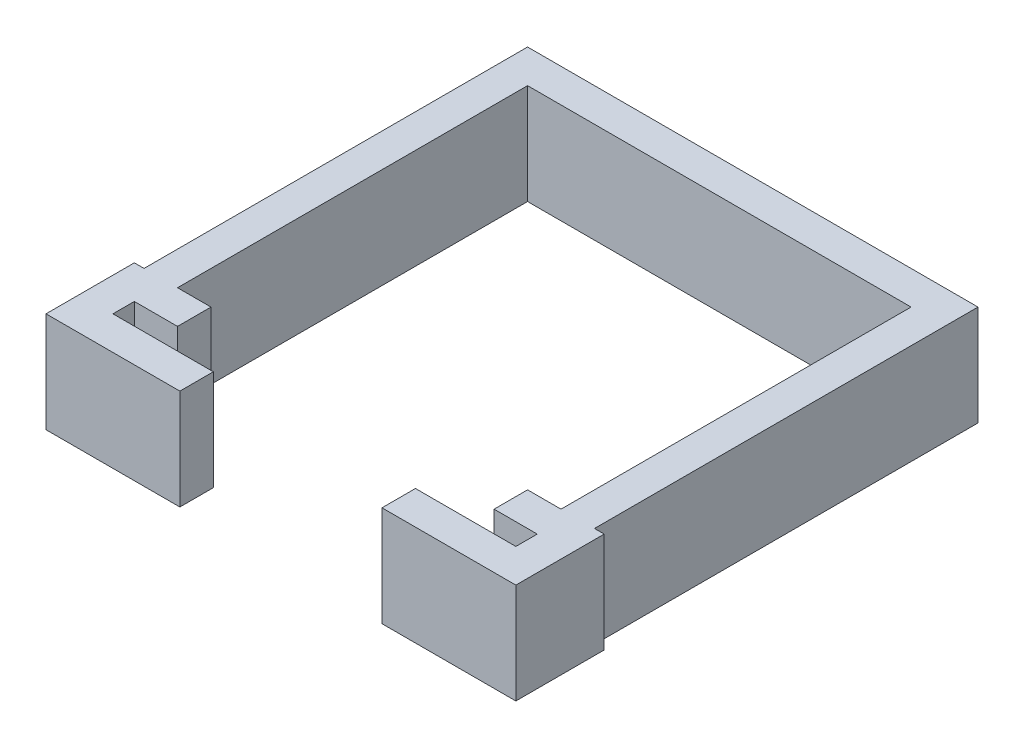
ISO-10303-21;
HEADER;
FILE_DESCRIPTION(('STEP AP214'),'2;1');
FILE_NAME('part.step','',(''),(''),'','','');
FILE_SCHEMA(('AUTOMOTIVE_DESIGN { 1 0 10303 214 1 1 1 1 }'));
ENDSEC;
DATA;
#1=APPLICATION_CONTEXT('core data for automotive mechanical design processes');
#2=APPLICATION_PROTOCOL_DEFINITION('international standard','automotive_design',2000,#1);
#3=PRODUCT_CONTEXT('',#1,'mechanical');
#4=PRODUCT('Part','Part','',(#3));
#5=PRODUCT_RELATED_PRODUCT_CATEGORY('part','',(#4));
#6=PRODUCT_DEFINITION_FORMATION('','',#4);
#7=PRODUCT_DEFINITION_CONTEXT('part definition',#1,'design');
#8=PRODUCT_DEFINITION('design','',#6,#7);
#9=PRODUCT_DEFINITION_SHAPE('','',#8);
#10=(LENGTH_UNIT() NAMED_UNIT(*) SI_UNIT(.MILLI.,.METRE.));
#11=(NAMED_UNIT(*) PLANE_ANGLE_UNIT() SI_UNIT($,.RADIAN.));
#12=(NAMED_UNIT(*) SI_UNIT($,.STERADIAN.) SOLID_ANGLE_UNIT());
#13=UNCERTAINTY_MEASURE_WITH_UNIT(LENGTH_MEASURE(1.E-05),#10,'distance_accuracy_value','');
#14=(GEOMETRIC_REPRESENTATION_CONTEXT(3) GLOBAL_UNCERTAINTY_ASSIGNED_CONTEXT((#13)) GLOBAL_UNIT_ASSIGNED_CONTEXT((#10,
#11,#12)) REPRESENTATION_CONTEXT('',''));
#15=CARTESIAN_POINT('',(0.,0.,0.));
#16=DIRECTION('',(0.,0.,1.));
#17=DIRECTION('',(1.,0.,0.));
#18=AXIS2_PLACEMENT_3D('',#15,#16,#17);
#19=CARTESIAN_POINT('',(43.75,15.,3.2));
#20=DIRECTION('',(0.,0.,1.));
#21=DIRECTION('',(1.,0.,0.));
#22=AXIS2_PLACEMENT_3D('',#19,#20,#21);
#23=PLANE('',#22);
#24=DIRECTION('',(-1.,0.,0.));
#25=VECTOR('',#24,1.);
#26=CARTESIAN_POINT('',(43.75,0.,3.2));
#27=LINE('',#26,#25);
#28=CARTESIAN_POINT('',(58.75,0.,3.2));
#29=VERTEX_POINT('',#28);
#30=CARTESIAN_POINT('',(48.65,0.,3.2));
#31=VERTEX_POINT('',#30);
#32=EDGE_CURVE('E200',#29,#31,#27,.T.);
#33=ORIENTED_EDGE('',*,*,#32,.T.);
#34=CARTESIAN_POINT('',(48.65,2.15,3.2));
#35=DIRECTION('',(0.,0.,-1.));
#36=DIRECTION('',(-1.,0.,0.));
#37=AXIS2_PLACEMENT_3D('',#34,#35,#36);
#38=CIRCLE('',#37,2.15);
#39=EDGE_CURVE('E203',#31,#31,#38,.T.);
#40=ORIENTED_EDGE('',*,*,#39,.F.);
#41=CARTESIAN_POINT('',(43.75,0.,3.2));
#42=VERTEX_POINT('',#41);
#43=EDGE_CURVE('E210',#31,#42,#27,.T.);
#44=ORIENTED_EDGE('',*,*,#43,.T.);
#45=DIRECTION('',(0.,-1.,0.));
#46=VECTOR('',#45,1.);
#47=CARTESIAN_POINT('',(43.75,15.,3.2));
#48=LINE('',#47,#46);
#49=CARTESIAN_POINT('',(43.75,15.,3.2));
#50=VERTEX_POINT('',#49);
#51=EDGE_CURVE('E259',#50,#42,#48,.T.);
#52=ORIENTED_EDGE('',*,*,#51,.F.);
#53=DIRECTION('',(-1.,0.,0.));
#54=VECTOR('',#53,1.);
#55=CARTESIAN_POINT('',(43.75,15.,3.2));
#56=LINE('',#55,#54);
#57=CARTESIAN_POINT('',(58.75,15.,3.2));
#58=VERTEX_POINT('',#57);
#59=EDGE_CURVE('E325',#58,#50,#56,.T.);
#60=ORIENTED_EDGE('',*,*,#59,.F.);
#61=DIRECTION('',(0.,-1.,0.));
#62=VECTOR('',#61,1.);
#63=CARTESIAN_POINT('',(58.75,15.,3.2));
#64=LINE('',#63,#62);
#65=EDGE_CURVE('E206',#58,#29,#64,.T.);
#66=ORIENTED_EDGE('',*,*,#65,.T.);
#67=EDGE_LOOP('',(#33,#40,#44,#52,#60,#66));
#68=FACE_BOUND('',#67,.T.);
#69=ADVANCED_FACE('F31',(#68),#23,.F.);
#70=CARTESIAN_POINT('',(-1.45,15.,3.2));
#71=DIRECTION('',(0.,0.,1.));
#72=DIRECTION('',(1.,0.,0.));
#73=AXIS2_PLACEMENT_3D('',#70,#71,#72);
#74=PLANE('',#73);
#75=DIRECTION('',(-1.,0.,0.));
#76=VECTOR('',#75,1.);
#77=CARTESIAN_POINT('',(-1.45,0.,3.2));
#78=LINE('',#77,#76);
#79=CARTESIAN_POINT('',(13.55,0.,3.2));
#80=VERTEX_POINT('',#79);
#81=CARTESIAN_POINT('',(8.65,0.,3.2));
#82=VERTEX_POINT('',#81);
#83=EDGE_CURVE('E302',#80,#82,#78,.T.);
#84=ORIENTED_EDGE('',*,*,#83,.T.);
#85=CARTESIAN_POINT('',(8.65,2.15,3.2));
#86=DIRECTION('',(0.,0.,-1.));
#87=DIRECTION('',(-1.,0.,0.));
#88=AXIS2_PLACEMENT_3D('',#85,#86,#87);
#89=CIRCLE('',#88,2.15);
#90=EDGE_CURVE('E396',#82,#82,#89,.T.);
#91=ORIENTED_EDGE('',*,*,#90,.F.);
#92=CARTESIAN_POINT('',(-1.45,0.,3.2));
#93=VERTEX_POINT('',#92);
#94=EDGE_CURVE('E296',#82,#93,#78,.T.);
#95=ORIENTED_EDGE('',*,*,#94,.T.);
#96=DIRECTION('',(0.,-1.,0.));
#97=VECTOR('',#96,1.);
#98=CARTESIAN_POINT('',(-1.45,15.,3.2));
#99=LINE('',#98,#97);
#100=CARTESIAN_POINT('',(-1.45,15.,3.2));
#101=VERTEX_POINT('',#100);
#102=EDGE_CURVE('E273',#101,#93,#99,.T.);
#103=ORIENTED_EDGE('',*,*,#102,.F.);
#104=DIRECTION('',(-1.,0.,0.));
#105=VECTOR('',#104,1.);
#106=CARTESIAN_POINT('',(-1.45,15.,3.2));
#107=LINE('',#106,#105);
#108=CARTESIAN_POINT('',(13.55,15.,3.2));
#109=VERTEX_POINT('',#108);
#110=EDGE_CURVE('E368',#109,#101,#107,.T.);
#111=ORIENTED_EDGE('',*,*,#110,.F.);
#112=DIRECTION('',(0.,-1.,0.));
#113=VECTOR('',#112,1.);
#114=CARTESIAN_POINT('',(13.55,15.,3.2));
#115=LINE('',#114,#113);
#116=EDGE_CURVE('E276',#109,#80,#115,.T.);
#117=ORIENTED_EDGE('',*,*,#116,.T.);
#118=EDGE_LOOP('',(#84,#91,#95,#103,#111,#117));
#119=FACE_BOUND('',#118,.T.);
#120=ADVANCED_FACE('F429',(#119),#74,.F.);
#121=CARTESIAN_POINT('',(57.3,15.,0.));
#122=DIRECTION('',(1.,0.,0.));
#123=DIRECTION('',(0.,0.,-1.));
#124=AXIS2_PLACEMENT_3D('',#121,#122,#123);
#125=PLANE('',#124);
#126=DIRECTION('',(0.,-1.,0.));
#127=VECTOR('',#126,1.);
#128=CARTESIAN_POINT('',(57.3,15.,-5.));
#129=LINE('',#128,#127);
#130=CARTESIAN_POINT('',(57.3,15.,-5.));
#131=VERTEX_POINT('',#130);
#132=CARTESIAN_POINT('',(57.3,0.,-5.));
#133=VERTEX_POINT('',#132);
#134=EDGE_CURVE('E46',#131,#133,#129,.T.);
#135=ORIENTED_EDGE('',*,*,#134,.F.);
#136=DIRECTION('',(0.,0.,1.));
#137=VECTOR('',#136,1.);
#138=CARTESIAN_POINT('',(57.3,15.,0.));
#139=LINE('',#138,#137);
#140=CARTESIAN_POINT('',(57.3,15.,-57.3));
#141=VERTEX_POINT('',#140);
#142=EDGE_CURVE('E330',#141,#131,#139,.T.);
#143=ORIENTED_EDGE('',*,*,#142,.F.);
#144=DIRECTION('',(0.,-1.,0.));
#145=VECTOR('',#144,1.);
#146=CARTESIAN_POINT('',(57.3,15.,-57.3));
#147=LINE('',#146,#145);
#148=CARTESIAN_POINT('',(57.3,0.,-57.3));
#149=VERTEX_POINT('',#148);
#150=EDGE_CURVE('E265',#141,#149,#147,.T.);
#151=ORIENTED_EDGE('',*,*,#150,.T.);
#152=DIRECTION('',(0.,0.,1.));
#153=VECTOR('',#152,1.);
#154=CARTESIAN_POINT('',(57.3,0.,0.));
#155=LINE('',#154,#153);
#156=EDGE_CURVE('E51',#149,#133,#155,.T.);
#157=ORIENTED_EDGE('',*,*,#156,.T.);
#158=EDGE_LOOP('',(#135,#143,#151,#157));
#159=FACE_BOUND('',#158,.T.);
#160=ADVANCED_FACE('F427',(#159),#125,.F.);
#161=CARTESIAN_POINT('',(0.,15.,-57.3));
#162=DIRECTION('',(-1.,0.,0.));
#163=DIRECTION('',(0.,0.,1.));
#164=AXIS2_PLACEMENT_3D('',#161,#162,#163);
#165=PLANE('',#164);
#166=DIRECTION('',(0.,-1.,0.));
#167=VECTOR('',#166,1.);
#168=CARTESIAN_POINT('',(0.,15.,-5.));
#169=LINE('',#168,#167);
#170=CARTESIAN_POINT('',(0.,15.,-5.));
#171=VERTEX_POINT('',#170);
#172=CARTESIAN_POINT('',(0.,0.,-5.));
#173=VERTEX_POINT('',#172);
#174=EDGE_CURVE('E357',#171,#173,#169,.T.);
#175=ORIENTED_EDGE('',*,*,#174,.T.);
#176=DIRECTION('',(0.,0.,-1.));
#177=VECTOR('',#176,1.);
#178=CARTESIAN_POINT('',(0.,0.,-57.3));
#179=LINE('',#178,#177);
#180=CARTESIAN_POINT('',(0.,0.,-57.3));
#181=VERTEX_POINT('',#180);
#182=EDGE_CURVE('E308',#173,#181,#179,.T.);
#183=ORIENTED_EDGE('',*,*,#182,.T.);
#184=DIRECTION('',(0.,-1.,0.));
#185=VECTOR('',#184,1.);
#186=CARTESIAN_POINT('',(0.,15.,-57.3));
#187=LINE('',#186,#185);
#188=CARTESIAN_POINT('',(0.,15.,-57.3));
#189=VERTEX_POINT('',#188);
#190=EDGE_CURVE('E267',#189,#181,#187,.T.);
#191=ORIENTED_EDGE('',*,*,#190,.F.);
#192=DIRECTION('',(0.,0.,-1.));
#193=VECTOR('',#192,1.);
#194=CARTESIAN_POINT('',(0.,15.,-57.3));
#195=LINE('',#194,#193);
#196=EDGE_CURVE('E374',#171,#189,#195,.T.);
#197=ORIENTED_EDGE('',*,*,#196,.F.);
#198=EDGE_LOOP('',(#175,#183,#191,#197));
#199=FACE_BOUND('',#198,.T.);
#200=ADVANCED_FACE('F416',(#199),#165,.F.);
#201=CARTESIAN_POINT('',(-6.45,15.,-5.));
#202=DIRECTION('',(0.,0.,1.));
#203=DIRECTION('',(1.,0.,0.));
#204=AXIS2_PLACEMENT_3D('',#201,#202,#203);
#205=PLANE('',#204);
#206=DIRECTION('',(-1.,0.,0.));
#207=VECTOR('',#206,1.);
#208=CARTESIAN_POINT('',(-6.45,0.,-5.));
#209=LINE('',#208,#207);
#210=CARTESIAN_POINT('',(-5.,0.,-5.));
#211=VERTEX_POINT('',#210);
#212=CARTESIAN_POINT('',(-6.45,0.,-5.));
#213=VERTEX_POINT('',#212);
#214=EDGE_CURVE('E298',#211,#213,#209,.T.);
#215=ORIENTED_EDGE('',*,*,#214,.T.);
#216=DIRECTION('',(0.,-1.,0.));
#217=VECTOR('',#216,1.);
#218=CARTESIAN_POINT('',(-6.45,15.,-5.));
#219=LINE('',#218,#217);
#220=CARTESIAN_POINT('',(-6.45,15.,-5.));
#221=VERTEX_POINT('',#220);
#222=EDGE_CURVE('E11',#221,#213,#219,.T.);
#223=ORIENTED_EDGE('',*,*,#222,.F.);
#224=DIRECTION('',(-1.,0.,0.));
#225=VECTOR('',#224,1.);
#226=CARTESIAN_POINT('',(-6.45,15.,-5.));
#227=LINE('',#226,#225);
#228=CARTESIAN_POINT('',(-5.,15.,-5.));
#229=VERTEX_POINT('',#228);
#230=EDGE_CURVE('E236',#229,#221,#227,.T.);
#231=ORIENTED_EDGE('',*,*,#230,.F.);
#232=DIRECTION('',(0.,-1.,0.));
#233=VECTOR('',#232,1.);
#234=CARTESIAN_POINT('',(-5.,15.,-5.));
#235=LINE('',#234,#233);
#236=EDGE_CURVE('E237',#229,#211,#235,.T.);
#237=ORIENTED_EDGE('',*,*,#236,.T.);
#238=EDGE_LOOP('',(#215,#223,#231,#237));
#239=FACE_BOUND('',#238,.T.);
#240=ADVANCED_FACE('F33',(#239),#205,.F.);
#241=CARTESIAN_POINT('',(-6.45,15.,8.20000000000001));
#242=DIRECTION('',(1.,0.,0.));
#243=DIRECTION('',(0.,0.,-1.));
#244=AXIS2_PLACEMENT_3D('',#241,#242,#243);
#245=PLANE('',#244);
#246=DIRECTION('',(0.,0.,1.));
#247=VECTOR('',#246,1.);
#248=CARTESIAN_POINT('',(-6.45,0.,8.20000000000001));
#249=LINE('',#248,#247);
#250=CARTESIAN_POINT('',(-6.45,0.,8.20000000000001));
#251=VERTEX_POINT('',#250);
#252=EDGE_CURVE('E292',#213,#251,#249,.T.);
#253=ORIENTED_EDGE('',*,*,#252,.T.);
#254=DIRECTION('',(0.,-1.,0.));
#255=VECTOR('',#254,1.);
#256=CARTESIAN_POINT('',(-6.45,15.,8.20000000000001));
#257=LINE('',#256,#255);
#258=CARTESIAN_POINT('',(-6.45,15.,8.20000000000001));
#259=VERTEX_POINT('',#258);
#260=EDGE_CURVE('E39',#259,#251,#257,.T.);
#261=ORIENTED_EDGE('',*,*,#260,.F.);
#262=DIRECTION('',(0.,0.,1.));
#263=VECTOR('',#262,1.);
#264=CARTESIAN_POINT('',(-6.45,15.,8.20000000000001));
#265=LINE('',#264,#263);
#266=EDGE_CURVE('E363',#221,#259,#265,.T.);
#267=ORIENTED_EDGE('',*,*,#266,.F.);
#268=ORIENTED_EDGE('',*,*,#222,.T.);
#269=EDGE_LOOP('',(#253,#261,#267,#268));
#270=FACE_BOUND('',#269,.T.);
#271=ADVANCED_FACE('F469',(#270),#245,.F.);
#272=CARTESIAN_POINT('',(13.55,15.,8.2));
#273=DIRECTION('',(0.,0.,-1.));
#274=DIRECTION('',(-1.,0.,0.));
#275=AXIS2_PLACEMENT_3D('',#272,#273,#274);
#276=PLANE('',#275);
#277=DIRECTION('',(1.,0.,0.));
#278=VECTOR('',#277,1.);
#279=CARTESIAN_POINT('',(13.55,0.,8.2));
#280=LINE('',#279,#278);
#281=CARTESIAN_POINT('',(13.55,0.,8.2));
#282=VERTEX_POINT('',#281);
#283=EDGE_CURVE('E288',#251,#282,#280,.T.);
#284=ORIENTED_EDGE('',*,*,#283,.T.);
#285=DIRECTION('',(0.,-1.,0.));
#286=VECTOR('',#285,1.);
#287=CARTESIAN_POINT('',(13.55,15.,8.2));
#288=LINE('',#287,#286);
#289=CARTESIAN_POINT('',(13.55,15.,8.2));
#290=VERTEX_POINT('',#289);
#291=EDGE_CURVE('E279',#290,#282,#288,.T.);
#292=ORIENTED_EDGE('',*,*,#291,.F.);
#293=DIRECTION('',(1.,0.,0.));
#294=VECTOR('',#293,1.);
#295=CARTESIAN_POINT('',(13.55,15.,8.2));
#296=LINE('',#295,#294);
#297=EDGE_CURVE('E289',#259,#290,#296,.T.);
#298=ORIENTED_EDGE('',*,*,#297,.F.);
#299=ORIENTED_EDGE('',*,*,#260,.T.);
#300=EDGE_LOOP('',(#284,#292,#298,#299));
#301=FACE_BOUND('',#300,.T.);
#302=ADVANCED_FACE('F286',(#301),#276,.F.);
#303=CARTESIAN_POINT('',(13.55,15.,3.2));
#304=DIRECTION('',(-1.,0.,0.));
#305=DIRECTION('',(0.,0.,1.));
#306=AXIS2_PLACEMENT_3D('',#303,#304,#305);
#307=PLANE('',#306);
#308=DIRECTION('',(0.,0.,-1.));
#309=VECTOR('',#308,1.);
#310=CARTESIAN_POINT('',(13.55,0.,3.2));
#311=LINE('',#310,#309);
#312=EDGE_CURVE('E294',#282,#80,#311,.T.);
#313=ORIENTED_EDGE('',*,*,#312,.T.);
#314=ORIENTED_EDGE('',*,*,#116,.F.);
#315=DIRECTION('',(0.,0.,-1.));
#316=VECTOR('',#315,1.);
#317=CARTESIAN_POINT('',(13.55,15.,3.2));
#318=LINE('',#317,#316);
#319=EDGE_CURVE('E366',#290,#109,#318,.T.);
#320=ORIENTED_EDGE('',*,*,#319,.F.);
#321=ORIENTED_EDGE('',*,*,#291,.T.);
#322=EDGE_LOOP('',(#313,#314,#320,#321));
#323=FACE_BOUND('',#322,.T.);
#324=ADVANCED_FACE('F462',(#323),#307,.F.);
#325=CARTESIAN_POINT('',(-1.45,15.,0.));
#326=DIRECTION('',(-1.,0.,0.));
#327=DIRECTION('',(0.,0.,1.));
#328=AXIS2_PLACEMENT_3D('',#325,#326,#327);
#329=PLANE('',#328);
#330=DIRECTION('',(0.,0.,-1.));
#331=VECTOR('',#330,1.);
#332=CARTESIAN_POINT('',(-1.45,0.,0.));
#333=LINE('',#332,#331);
#334=CARTESIAN_POINT('',(-1.45,0.,0.));
#335=VERTEX_POINT('',#334);
#336=EDGE_CURVE('E304',#93,#335,#333,.T.);
#337=ORIENTED_EDGE('',*,*,#336,.T.);
#338=DIRECTION('',(0.,-1.,0.));
#339=VECTOR('',#338,1.);
#340=CARTESIAN_POINT('',(-1.45,15.,0.));
#341=LINE('',#340,#339);
#342=CARTESIAN_POINT('',(-1.45,15.,0.));
#343=VERTEX_POINT('',#342);
#344=EDGE_CURVE('E270',#343,#335,#341,.T.);
#345=ORIENTED_EDGE('',*,*,#344,.F.);
#346=DIRECTION('',(0.,0.,-1.));
#347=VECTOR('',#346,1.);
#348=CARTESIAN_POINT('',(-1.45,15.,0.));
#349=LINE('',#348,#347);
#350=EDGE_CURVE('E370',#101,#343,#349,.T.);
#351=ORIENTED_EDGE('',*,*,#350,.F.);
#352=ORIENTED_EDGE('',*,*,#102,.T.);
#353=EDGE_LOOP('',(#337,#345,#351,#352));
#354=FACE_BOUND('',#353,.T.);
#355=ADVANCED_FACE('F457',(#354),#329,.F.);
#356=CARTESIAN_POINT('',(0.,15.,0.));
#357=DIRECTION('',(0.,0.,-1.));
#358=DIRECTION('',(-1.,0.,0.));
#359=AXIS2_PLACEMENT_3D('',#356,#357,#358);
#360=PLANE('',#359);
#361=DIRECTION('',(1.,0.,0.));
#362=VECTOR('',#361,1.);
#363=CARTESIAN_POINT('',(0.,0.,0.));
#364=LINE('',#363,#362);
#365=CARTESIAN_POINT('',(5.,0.,0.));
#366=VERTEX_POINT('',#365);
#367=EDGE_CURVE('E306',#335,#366,#364,.T.);
#368=ORIENTED_EDGE('',*,*,#367,.T.);
#369=DIRECTION('',(0.,-1.,0.));
#370=VECTOR('',#369,1.);
#371=CARTESIAN_POINT('',(5.,15.,0.));
#372=LINE('',#371,#370);
#373=CARTESIAN_POINT('',(5.,15.,0.));
#374=VERTEX_POINT('',#373);
#375=EDGE_CURVE('E346',#374,#366,#372,.T.);
#376=ORIENTED_EDGE('',*,*,#375,.F.);
#377=DIRECTION('',(1.,0.,0.));
#378=VECTOR('',#377,1.);
#379=CARTESIAN_POINT('',(0.,15.,0.));
#380=LINE('',#379,#378);
#381=EDGE_CURVE('E372',#343,#374,#380,.T.);
#382=ORIENTED_EDGE('',*,*,#381,.F.);
#383=ORIENTED_EDGE('',*,*,#344,.T.);
#384=EDGE_LOOP('',(#368,#376,#382,#383));
#385=FACE_BOUND('',#384,.T.);
#386=ADVANCED_FACE('F453',(#385),#360,.F.);
#387=CARTESIAN_POINT('',(57.3,15.,-57.3));
#388=DIRECTION('',(0.,0.,-1.));
#389=DIRECTION('',(-1.,0.,0.));
#390=AXIS2_PLACEMENT_3D('',#387,#388,#389);
#391=PLANE('',#390);
#392=DIRECTION('',(1.,0.,0.));
#393=VECTOR('',#392,1.);
#394=CARTESIAN_POINT('',(57.3,0.,-57.3));
#395=LINE('',#394,#393);
#396=EDGE_CURVE('E310',#181,#149,#395,.T.);
#397=ORIENTED_EDGE('',*,*,#396,.T.);
#398=ORIENTED_EDGE('',*,*,#150,.F.);
#399=DIRECTION('',(1.,0.,0.));
#400=VECTOR('',#399,1.);
#401=CARTESIAN_POINT('',(57.3,15.,-57.3));
#402=LINE('',#401,#400);
#403=EDGE_CURVE('E376',#189,#141,#402,.T.);
#404=ORIENTED_EDGE('',*,*,#403,.F.);
#405=ORIENTED_EDGE('',*,*,#190,.T.);
#406=EDGE_LOOP('',(#397,#398,#404,#405));
#407=FACE_BOUND('',#406,.T.);
#408=ADVANCED_FACE('F426',(#407),#391,.F.);
#409=CARTESIAN_POINT('',(58.75,15.,0.));
#410=DIRECTION('',(0.,0.,-1.));
#411=DIRECTION('',(-1.,0.,0.));
#412=AXIS2_PLACEMENT_3D('',#409,#410,#411);
#413=PLANE('',#412);
#414=DIRECTION('',(1.,0.,0.));
#415=VECTOR('',#414,1.);
#416=CARTESIAN_POINT('',(58.75,0.,0.));
#417=LINE('',#416,#415);
#418=CARTESIAN_POINT('',(52.3,0.,0.));
#419=VERTEX_POINT('',#418);
#420=CARTESIAN_POINT('',(58.75,0.,0.));
#421=VERTEX_POINT('',#420);
#422=EDGE_CURVE('E219',#419,#421,#417,.T.);
#423=ORIENTED_EDGE('',*,*,#422,.T.);
#424=DIRECTION('',(0.,-1.,0.));
#425=VECTOR('',#424,1.);
#426=CARTESIAN_POINT('',(58.75,15.,0.));
#427=LINE('',#426,#425);
#428=CARTESIAN_POINT('',(58.75,15.,0.));
#429=VERTEX_POINT('',#428);
#430=EDGE_CURVE('E262',#429,#421,#427,.T.);
#431=ORIENTED_EDGE('',*,*,#430,.F.);
#432=DIRECTION('',(1.,0.,0.));
#433=VECTOR('',#432,1.);
#434=CARTESIAN_POINT('',(58.75,15.,0.));
#435=LINE('',#434,#433);
#436=CARTESIAN_POINT('',(52.3,15.,0.));
#437=VERTEX_POINT('',#436);
#438=EDGE_CURVE('E326',#437,#429,#435,.T.);
#439=ORIENTED_EDGE('',*,*,#438,.F.);
#440=DIRECTION('',(0.,-1.,0.));
#441=VECTOR('',#440,1.);
#442=CARTESIAN_POINT('',(52.3,15.,0.));
#443=LINE('',#442,#441);
#444=EDGE_CURVE('E318',#437,#419,#443,.T.);
#445=ORIENTED_EDGE('',*,*,#444,.T.);
#446=EDGE_LOOP('',(#423,#431,#439,#445));
#447=FACE_BOUND('',#446,.T.);
#448=ADVANCED_FACE('F315',(#447),#413,.F.);
#449=CARTESIAN_POINT('',(58.75,15.,3.2));
#450=DIRECTION('',(1.,0.,0.));
#451=DIRECTION('',(0.,0.,-1.));
#452=AXIS2_PLACEMENT_3D('',#449,#450,#451);
#453=PLANE('',#452);
#454=DIRECTION('',(0.,0.,1.));
#455=VECTOR('',#454,1.);
#456=CARTESIAN_POINT('',(58.75,0.,3.2));
#457=LINE('',#456,#455);
#458=EDGE_CURVE('E218',#421,#29,#457,.T.);
#459=ORIENTED_EDGE('',*,*,#458,.T.);
#460=ORIENTED_EDGE('',*,*,#65,.F.);
#461=DIRECTION('',(0.,0.,1.));
#462=VECTOR('',#461,1.);
#463=CARTESIAN_POINT('',(58.75,15.,3.2));
#464=LINE('',#463,#462);
#465=EDGE_CURVE('E323',#429,#58,#464,.T.);
#466=ORIENTED_EDGE('',*,*,#465,.F.);
#467=ORIENTED_EDGE('',*,*,#430,.T.);
#468=EDGE_LOOP('',(#459,#460,#466,#467));
#469=FACE_BOUND('',#468,.T.);
#470=ADVANCED_FACE('F322',(#469),#453,.F.);
#471=CARTESIAN_POINT('',(43.75,15.,8.2));
#472=DIRECTION('',(1.,0.,0.));
#473=DIRECTION('',(0.,0.,-1.));
#474=AXIS2_PLACEMENT_3D('',#471,#472,#473);
#475=PLANE('',#474);
#476=DIRECTION('',(0.,0.,1.));
#477=VECTOR('',#476,1.);
#478=CARTESIAN_POINT('',(43.75,0.,8.2));
#479=LINE('',#478,#477);
#480=CARTESIAN_POINT('',(43.75,0.,8.2));
#481=VERTEX_POINT('',#480);
#482=EDGE_CURVE('E209',#42,#481,#479,.T.);
#483=ORIENTED_EDGE('',*,*,#482,.T.);
#484=DIRECTION('',(0.,-1.,0.));
#485=VECTOR('',#484,1.);
#486=CARTESIAN_POINT('',(43.75,15.,8.2));
#487=LINE('',#486,#485);
#488=CARTESIAN_POINT('',(43.75,15.,8.2));
#489=VERTEX_POINT('',#488);
#490=EDGE_CURVE('E256',#489,#481,#487,.T.);
#491=ORIENTED_EDGE('',*,*,#490,.F.);
#492=DIRECTION('',(0.,0.,1.));
#493=VECTOR('',#492,1.);
#494=CARTESIAN_POINT('',(43.75,15.,8.2));
#495=LINE('',#494,#493);
#496=EDGE_CURVE('E328',#50,#489,#495,.T.);
#497=ORIENTED_EDGE('',*,*,#496,.F.);
#498=ORIENTED_EDGE('',*,*,#51,.T.);
#499=EDGE_LOOP('',(#483,#491,#497,#498));
#500=FACE_BOUND('',#499,.T.);
#501=ADVANCED_FACE('F446',(#500),#475,.F.);
#502=CARTESIAN_POINT('',(63.75,15.,8.2));
#503=DIRECTION('',(0.,0.,-1.));
#504=DIRECTION('',(-1.,0.,0.));
#505=AXIS2_PLACEMENT_3D('',#502,#503,#504);
#506=PLANE('',#505);
#507=DIRECTION('',(1.,0.,0.));
#508=VECTOR('',#507,1.);
#509=CARTESIAN_POINT('',(63.75,0.,8.2));
#510=LINE('',#509,#508);
#511=CARTESIAN_POINT('',(63.75,0.,8.2));
#512=VERTEX_POINT('',#511);
#513=EDGE_CURVE('E224',#481,#512,#510,.T.);
#514=ORIENTED_EDGE('',*,*,#513,.T.);
#515=DIRECTION('',(0.,-1.,0.));
#516=VECTOR('',#515,1.);
#517=CARTESIAN_POINT('',(63.75,15.,8.2));
#518=LINE('',#517,#516);
#519=CARTESIAN_POINT('',(63.75,15.,8.2));
#520=VERTEX_POINT('',#519);
#521=EDGE_CURVE('E253',#520,#512,#518,.T.);
#522=ORIENTED_EDGE('',*,*,#521,.F.);
#523=DIRECTION('',(1.,0.,0.));
#524=VECTOR('',#523,1.);
#525=CARTESIAN_POINT('',(63.75,15.,8.2));
#526=LINE('',#525,#524);
#527=EDGE_CURVE('E335',#489,#520,#526,.T.);
#528=ORIENTED_EDGE('',*,*,#527,.F.);
#529=ORIENTED_EDGE('',*,*,#490,.T.);
#530=EDGE_LOOP('',(#514,#522,#528,#529));
#531=FACE_BOUND('',#530,.T.);
#532=ADVANCED_FACE('F503',(#531),#506,.F.);
#533=CARTESIAN_POINT('',(63.75,15.,-5.));
#534=DIRECTION('',(-1.,0.,0.));
#535=DIRECTION('',(0.,0.,1.));
#536=AXIS2_PLACEMENT_3D('',#533,#534,#535);
#537=PLANE('',#536);
#538=DIRECTION('',(0.,0.,-1.));
#539=VECTOR('',#538,1.);
#540=CARTESIAN_POINT('',(63.75,0.,-5.));
#541=LINE('',#540,#539);
#542=CARTESIAN_POINT('',(63.75,0.,-5.));
#543=VERTEX_POINT('',#542);
#544=EDGE_CURVE('E226',#512,#543,#541,.T.);
#545=ORIENTED_EDGE('',*,*,#544,.T.);
#546=DIRECTION('',(0.,-1.,0.));
#547=VECTOR('',#546,1.);
#548=CARTESIAN_POINT('',(63.75,15.,-5.));
#549=LINE('',#548,#547);
#550=CARTESIAN_POINT('',(63.75,15.,-5.));
#551=VERTEX_POINT('',#550);
#552=EDGE_CURVE('E250',#551,#543,#549,.T.);
#553=ORIENTED_EDGE('',*,*,#552,.F.);
#554=DIRECTION('',(0.,0.,-1.));
#555=VECTOR('',#554,1.);
#556=CARTESIAN_POINT('',(63.75,15.,-5.));
#557=LINE('',#556,#555);
#558=EDGE_CURVE('E337',#520,#551,#557,.T.);
#559=ORIENTED_EDGE('',*,*,#558,.F.);
#560=ORIENTED_EDGE('',*,*,#521,.T.);
#561=EDGE_LOOP('',(#545,#553,#559,#560));
#562=FACE_BOUND('',#561,.T.);
#563=ADVANCED_FACE('F498',(#562),#537,.F.);
#564=CARTESIAN_POINT('',(62.3,15.,-5.));
#565=DIRECTION('',(0.,0.,1.));
#566=DIRECTION('',(1.,0.,0.));
#567=AXIS2_PLACEMENT_3D('',#564,#565,#566);
#568=PLANE('',#567);
#569=DIRECTION('',(-1.,0.,0.));
#570=VECTOR('',#569,1.);
#571=CARTESIAN_POINT('',(62.3,0.,-5.));
#572=LINE('',#571,#570);
#573=CARTESIAN_POINT('',(62.3,0.,-5.));
#574=VERTEX_POINT('',#573);
#575=EDGE_CURVE('E228',#543,#574,#572,.T.);
#576=ORIENTED_EDGE('',*,*,#575,.T.);
#577=DIRECTION('',(0.,-1.,0.));
#578=VECTOR('',#577,1.);
#579=CARTESIAN_POINT('',(62.3,15.,-5.));
#580=LINE('',#579,#578);
#581=CARTESIAN_POINT('',(62.3,15.,-5.));
#582=VERTEX_POINT('',#581);
#583=EDGE_CURVE('E247',#582,#574,#580,.T.);
#584=ORIENTED_EDGE('',*,*,#583,.F.);
#585=DIRECTION('',(-1.,0.,0.));
#586=VECTOR('',#585,1.);
#587=CARTESIAN_POINT('',(62.3,15.,-5.));
#588=LINE('',#587,#586);
#589=EDGE_CURVE('E339',#551,#582,#588,.T.);
#590=ORIENTED_EDGE('',*,*,#589,.F.);
#591=ORIENTED_EDGE('',*,*,#552,.T.);
#592=EDGE_LOOP('',(#576,#584,#590,#591));
#593=FACE_BOUND('',#592,.T.);
#594=ADVANCED_FACE('F494',(#593),#568,.F.);
#595=CARTESIAN_POINT('',(62.3,15.,-62.3));
#596=DIRECTION('',(-1.,0.,0.));
#597=DIRECTION('',(0.,0.,1.));
#598=AXIS2_PLACEMENT_3D('',#595,#596,#597);
#599=PLANE('',#598);
#600=DIRECTION('',(0.,0.,-1.));
#601=VECTOR('',#600,1.);
#602=CARTESIAN_POINT('',(62.3,0.,-62.3));
#603=LINE('',#602,#601);
#604=CARTESIAN_POINT('',(62.3,0.,-62.3));
#605=VERTEX_POINT('',#604);
#606=EDGE_CURVE('E230',#574,#605,#603,.T.);
#607=ORIENTED_EDGE('',*,*,#606,.T.);
#608=DIRECTION('',(0.,-1.,0.));
#609=VECTOR('',#608,1.);
#610=CARTESIAN_POINT('',(62.3,15.,-62.3));
#611=LINE('',#610,#609);
#612=CARTESIAN_POINT('',(62.3,15.,-62.3));
#613=VERTEX_POINT('',#612);
#614=EDGE_CURVE('E244',#613,#605,#611,.T.);
#615=ORIENTED_EDGE('',*,*,#614,.F.);
#616=DIRECTION('',(0.,0.,-1.));
#617=VECTOR('',#616,1.);
#618=CARTESIAN_POINT('',(62.3,15.,-62.3));
#619=LINE('',#618,#617);
#620=EDGE_CURVE('E341',#582,#613,#619,.T.);
#621=ORIENTED_EDGE('',*,*,#620,.F.);
#622=ORIENTED_EDGE('',*,*,#583,.T.);
#623=EDGE_LOOP('',(#607,#615,#621,#622));
#624=FACE_BOUND('',#623,.T.);
#625=ADVANCED_FACE('F490',(#624),#599,.F.);
#626=CARTESIAN_POINT('',(-5.,15.,-62.3));
#627=DIRECTION('',(0.,0.,1.));
#628=DIRECTION('',(1.,0.,0.));
#629=AXIS2_PLACEMENT_3D('',#626,#627,#628);
#630=PLANE('',#629);
#631=DIRECTION('',(-1.,0.,0.));
#632=VECTOR('',#631,1.);
#633=CARTESIAN_POINT('',(-5.,0.,-62.3));
#634=LINE('',#633,#632);
#635=CARTESIAN_POINT('',(-5.,0.,-62.3));
#636=VERTEX_POINT('',#635);
#637=EDGE_CURVE('E232',#605,#636,#634,.T.);
#638=ORIENTED_EDGE('',*,*,#637,.T.);
#639=DIRECTION('',(0.,-1.,0.));
#640=VECTOR('',#639,1.);
#641=CARTESIAN_POINT('',(-5.,15.,-62.3));
#642=LINE('',#641,#640);
#643=CARTESIAN_POINT('',(-5.,15.,-62.3));
#644=VERTEX_POINT('',#643);
#645=EDGE_CURVE('E240',#644,#636,#642,.T.);
#646=ORIENTED_EDGE('',*,*,#645,.F.);
#647=DIRECTION('',(-1.,0.,0.));
#648=VECTOR('',#647,1.);
#649=CARTESIAN_POINT('',(-5.,15.,-62.3));
#650=LINE('',#649,#648);
#651=EDGE_CURVE('E343',#613,#644,#650,.T.);
#652=ORIENTED_EDGE('',*,*,#651,.F.);
#653=ORIENTED_EDGE('',*,*,#614,.T.);
#654=EDGE_LOOP('',(#638,#646,#652,#653));
#655=FACE_BOUND('',#654,.T.);
#656=ADVANCED_FACE('F486',(#655),#630,.F.);
#657=CARTESIAN_POINT('',(-5.,15.,-5.));
#658=DIRECTION('',(1.,0.,0.));
#659=DIRECTION('',(0.,0.,-1.));
#660=AXIS2_PLACEMENT_3D('',#657,#658,#659);
#661=PLANE('',#660);
#662=DIRECTION('',(0.,0.,1.));
#663=VECTOR('',#662,1.);
#664=CARTESIAN_POINT('',(-5.,0.,-5.));
#665=LINE('',#664,#663);
#666=EDGE_CURVE('E234',#636,#211,#665,.T.);
#667=ORIENTED_EDGE('',*,*,#666,.T.);
#668=ORIENTED_EDGE('',*,*,#236,.F.);
#669=DIRECTION('',(0.,0.,1.));
#670=VECTOR('',#669,1.);
#671=CARTESIAN_POINT('',(-5.,15.,-5.));
#672=LINE('',#671,#670);
#673=EDGE_CURVE('E241',#644,#229,#672,.T.);
#674=ORIENTED_EDGE('',*,*,#673,.F.);
#675=ORIENTED_EDGE('',*,*,#645,.T.);
#676=EDGE_LOOP('',(#667,#668,#674,#675));
#677=FACE_BOUND('',#676,.T.);
#678=ADVANCED_FACE('F480',(#677),#661,.F.);
#679=CARTESIAN_POINT('',(-5.,15.,-5.));
#680=DIRECTION('',(0.,1.,0.));
#681=DIRECTION('',(0.,0.,1.));
#682=AXIS2_PLACEMENT_3D('',#679,#680,#681);
#683=PLANE('',#682);
#684=ORIENTED_EDGE('',*,*,#230,.T.);
#685=ORIENTED_EDGE('',*,*,#266,.T.);
#686=ORIENTED_EDGE('',*,*,#297,.T.);
#687=ORIENTED_EDGE('',*,*,#319,.T.);
#688=ORIENTED_EDGE('',*,*,#110,.T.);
#689=ORIENTED_EDGE('',*,*,#350,.T.);
#690=ORIENTED_EDGE('',*,*,#381,.T.);
#691=DIRECTION('',(0.,0.,-1.));
#692=VECTOR('',#691,1.);
#693=CARTESIAN_POINT('',(5.,15.,0.));
#694=LINE('',#693,#692);
#695=CARTESIAN_POINT('',(5.,15.,-5.));
#696=VERTEX_POINT('',#695);
#697=EDGE_CURVE('E405',#374,#696,#694,.T.);
#698=ORIENTED_EDGE('',*,*,#697,.T.);
#699=DIRECTION('',(-1.,0.,0.));
#700=VECTOR('',#699,1.);
#701=CARTESIAN_POINT('',(0.,15.,-5.));
#702=LINE('',#701,#700);
#703=EDGE_CURVE('E407',#696,#171,#702,.T.);
#704=ORIENTED_EDGE('',*,*,#703,.T.);
#705=ORIENTED_EDGE('',*,*,#196,.T.);
#706=ORIENTED_EDGE('',*,*,#403,.T.);
#707=ORIENTED_EDGE('',*,*,#142,.T.);
#708=DIRECTION('',(-1.,0.,0.));
#709=VECTOR('',#708,1.);
#710=CARTESIAN_POINT('',(57.3,15.,-5.));
#711=LINE('',#710,#709);
#712=CARTESIAN_POINT('',(52.3,15.,-5.));
#713=VERTEX_POINT('',#712);
#714=EDGE_CURVE('E380',#131,#713,#711,.T.);
#715=ORIENTED_EDGE('',*,*,#714,.T.);
#716=DIRECTION('',(0.,0.,1.));
#717=VECTOR('',#716,1.);
#718=CARTESIAN_POINT('',(52.3,15.,0.));
#719=LINE('',#718,#717);
#720=EDGE_CURVE('E389',#713,#437,#719,.T.);
#721=ORIENTED_EDGE('',*,*,#720,.T.);
#722=ORIENTED_EDGE('',*,*,#438,.T.);
#723=ORIENTED_EDGE('',*,*,#465,.T.);
#724=ORIENTED_EDGE('',*,*,#59,.T.);
#725=ORIENTED_EDGE('',*,*,#496,.T.);
#726=ORIENTED_EDGE('',*,*,#527,.T.);
#727=ORIENTED_EDGE('',*,*,#558,.T.);
#728=ORIENTED_EDGE('',*,*,#589,.T.);
#729=ORIENTED_EDGE('',*,*,#620,.T.);
#730=ORIENTED_EDGE('',*,*,#651,.T.);
#731=ORIENTED_EDGE('',*,*,#673,.T.);
#732=EDGE_LOOP('',(#684,#685,#686,#687,#688,#689,#690,#698,#704,#705,#706,#707,#715,#721,#722,
#723,#724,#725,#726,#727,#728,#729,#730,#731));
#733=FACE_BOUND('',#732,.T.);
#734=ADVANCED_FACE('F378',(#733),#683,.T.);
#735=CARTESIAN_POINT('',(-5.,0.,-5.));
#736=DIRECTION('',(0.,1.,0.));
#737=DIRECTION('',(0.,0.,1.));
#738=AXIS2_PLACEMENT_3D('',#735,#736,#737);
#739=PLANE('',#738);
#740=ORIENTED_EDGE('',*,*,#214,.F.);
#741=ORIENTED_EDGE('',*,*,#666,.F.);
#742=ORIENTED_EDGE('',*,*,#637,.F.);
#743=ORIENTED_EDGE('',*,*,#606,.F.);
#744=ORIENTED_EDGE('',*,*,#575,.F.);
#745=ORIENTED_EDGE('',*,*,#544,.F.);
#746=ORIENTED_EDGE('',*,*,#513,.F.);
#747=ORIENTED_EDGE('',*,*,#482,.F.);
#748=ORIENTED_EDGE('',*,*,#43,.F.);
#749=ORIENTED_EDGE('',*,*,#32,.F.);
#750=ORIENTED_EDGE('',*,*,#458,.F.);
#751=ORIENTED_EDGE('',*,*,#422,.F.);
#752=DIRECTION('',(0.,0.,1.));
#753=VECTOR('',#752,1.);
#754=CARTESIAN_POINT('',(52.3,0.,0.));
#755=LINE('',#754,#753);
#756=CARTESIAN_POINT('',(52.3,0.,-5.));
#757=VERTEX_POINT('',#756);
#758=EDGE_CURVE('E390',#757,#419,#755,.T.);
#759=ORIENTED_EDGE('',*,*,#758,.F.);
#760=DIRECTION('',(-1.,0.,0.));
#761=VECTOR('',#760,1.);
#762=CARTESIAN_POINT('',(57.3,0.,-5.));
#763=LINE('',#762,#761);
#764=EDGE_CURVE('E393',#133,#757,#763,.T.);
#765=ORIENTED_EDGE('',*,*,#764,.F.);
#766=ORIENTED_EDGE('',*,*,#156,.F.);
#767=ORIENTED_EDGE('',*,*,#396,.F.);
#768=ORIENTED_EDGE('',*,*,#182,.F.);
#769=DIRECTION('',(-1.,0.,0.));
#770=VECTOR('',#769,1.);
#771=CARTESIAN_POINT('',(0.,0.,-5.));
#772=LINE('',#771,#770);
#773=CARTESIAN_POINT('',(5.,0.,-5.));
#774=VERTEX_POINT('',#773);
#775=EDGE_CURVE('E408',#774,#173,#772,.T.);
#776=ORIENTED_EDGE('',*,*,#775,.F.);
#777=DIRECTION('',(0.,0.,-1.));
#778=VECTOR('',#777,1.);
#779=CARTESIAN_POINT('',(5.,0.,0.));
#780=LINE('',#779,#778);
#781=EDGE_CURVE('E404',#366,#774,#780,.T.);
#782=ORIENTED_EDGE('',*,*,#781,.F.);
#783=ORIENTED_EDGE('',*,*,#367,.F.);
#784=ORIENTED_EDGE('',*,*,#336,.F.);
#785=ORIENTED_EDGE('',*,*,#94,.F.);
#786=ORIENTED_EDGE('',*,*,#83,.F.);
#787=ORIENTED_EDGE('',*,*,#312,.F.);
#788=ORIENTED_EDGE('',*,*,#283,.F.);
#789=ORIENTED_EDGE('',*,*,#252,.F.);
#790=EDGE_LOOP('',(#740,#741,#742,#743,#744,#745,#746,#747,#748,#749,#750,#751,#759,#765,#766,
#767,#768,#776,#782,#783,#784,#785,#786,#787,#788,#789));
#791=FACE_BOUND('',#790,.T.);
#792=ADVANCED_FACE('F214',(#791),#739,.F.);
#793=CARTESIAN_POINT('',(5.,15.,0.));
#794=DIRECTION('',(-1.,0.,0.));
#795=DIRECTION('',(0.,0.,1.));
#796=AXIS2_PLACEMENT_3D('',#793,#794,#795);
#797=PLANE('',#796);
#798=ORIENTED_EDGE('',*,*,#781,.T.);
#799=DIRECTION('',(0.,-1.,0.));
#800=VECTOR('',#799,1.);
#801=CARTESIAN_POINT('',(5.,15.,-5.));
#802=LINE('',#801,#800);
#803=EDGE_CURVE('E350',#696,#774,#802,.T.);
#804=ORIENTED_EDGE('',*,*,#803,.F.);
#805=ORIENTED_EDGE('',*,*,#697,.F.);
#806=ORIENTED_EDGE('',*,*,#375,.T.);
#807=EDGE_LOOP('',(#798,#804,#805,#806));
#808=FACE_BOUND('',#807,.T.);
#809=ADVANCED_FACE('F526',(#808),#797,.F.);
#810=CARTESIAN_POINT('',(0.,15.,-5.));
#811=DIRECTION('',(0.,0.,1.));
#812=DIRECTION('',(1.,0.,0.));
#813=AXIS2_PLACEMENT_3D('',#810,#811,#812);
#814=PLANE('',#813);
#815=ORIENTED_EDGE('',*,*,#775,.T.);
#816=ORIENTED_EDGE('',*,*,#174,.F.);
#817=ORIENTED_EDGE('',*,*,#703,.F.);
#818=ORIENTED_EDGE('',*,*,#803,.T.);
#819=EDGE_LOOP('',(#815,#816,#817,#818));
#820=FACE_BOUND('',#819,.T.);
#821=ADVANCED_FACE('F421',(#820),#814,.F.);
#822=CARTESIAN_POINT('',(57.3,15.,-5.));
#823=DIRECTION('',(0.,0.,1.));
#824=DIRECTION('',(1.,0.,0.));
#825=AXIS2_PLACEMENT_3D('',#822,#823,#824);
#826=PLANE('',#825);
#827=ORIENTED_EDGE('',*,*,#764,.T.);
#828=DIRECTION('',(0.,-1.,0.));
#829=VECTOR('',#828,1.);
#830=CARTESIAN_POINT('',(52.3,15.,-5.));
#831=LINE('',#830,#829);
#832=EDGE_CURVE('E387',#713,#757,#831,.T.);
#833=ORIENTED_EDGE('',*,*,#832,.F.);
#834=ORIENTED_EDGE('',*,*,#714,.F.);
#835=ORIENTED_EDGE('',*,*,#134,.T.);
#836=EDGE_LOOP('',(#827,#833,#834,#835));
#837=FACE_BOUND('',#836,.T.);
#838=ADVANCED_FACE('F385',(#837),#826,.F.);
#839=CARTESIAN_POINT('',(52.3,15.,0.));
#840=DIRECTION('',(1.,0.,0.));
#841=DIRECTION('',(0.,0.,-1.));
#842=AXIS2_PLACEMENT_3D('',#839,#840,#841);
#843=PLANE('',#842);
#844=ORIENTED_EDGE('',*,*,#758,.T.);
#845=ORIENTED_EDGE('',*,*,#444,.F.);
#846=ORIENTED_EDGE('',*,*,#720,.F.);
#847=ORIENTED_EDGE('',*,*,#832,.T.);
#848=EDGE_LOOP('',(#844,#845,#846,#847));
#849=FACE_BOUND('',#848,.T.);
#850=ADVANCED_FACE('F535',(#849),#843,.F.);
#851=CARTESIAN_POINT('',(8.65,2.15,1.2));
#852=DIRECTION('',(0.,0.,1.));
#853=DIRECTION('',(1.,0.,0.));
#854=AXIS2_PLACEMENT_3D('',#851,#852,#853);
#855=CYLINDRICAL_SURFACE('',#854,2.15);
#856=CARTESIAN_POINT('',(8.65,2.15,1.2));
#857=DIRECTION('',(0.,0.,-1.));
#858=DIRECTION('',(-1.,0.,0.));
#859=AXIS2_PLACEMENT_3D('',#856,#857,#858);
#860=CIRCLE('',#859,2.15);
#861=CARTESIAN_POINT('',(6.5,2.15,1.2));
#862=VERTEX_POINT('',#861);
#863=EDGE_CURVE('E399',#862,#862,#860,.T.);
#864=ORIENTED_EDGE('',*,*,#863,.F.);
#865=EDGE_LOOP('',(#864));
#866=FACE_BOUND('',#865,.T.);
#867=ORIENTED_EDGE('',*,*,#90,.T.);
#868=EDGE_LOOP('',(#867));
#869=FACE_BOUND('',#868,.T.);
#870=ADVANCED_FACE('F538',(#866,#869),#855,.T.);
#871=CARTESIAN_POINT('',(8.65,2.15,1.2));
#872=DIRECTION('',(0.,0.,-1.));
#873=DIRECTION('',(-1.,0.,0.));
#874=AXIS2_PLACEMENT_3D('',#871,#872,#873);
#875=PLANE('',#874);
#876=ORIENTED_EDGE('',*,*,#863,.T.);
#877=EDGE_LOOP('',(#876));
#878=FACE_BOUND('',#877,.T.);
#879=ADVANCED_FACE('F542',(#878),#875,.T.);
#880=CARTESIAN_POINT('',(48.65,2.15,1.2));
#881=DIRECTION('',(0.,0.,1.));
#882=DIRECTION('',(1.,0.,0.));
#883=AXIS2_PLACEMENT_3D('',#880,#881,#882);
#884=CYLINDRICAL_SURFACE('',#883,2.15);
#885=CARTESIAN_POINT('',(48.65,2.15,1.2));
#886=DIRECTION('',(0.,0.,-1.));
#887=DIRECTION('',(-1.,0.,0.));
#888=AXIS2_PLACEMENT_3D('',#885,#886,#887);
#889=CIRCLE('',#888,2.15);
#890=CARTESIAN_POINT('',(46.5,2.15,1.2));
#891=VERTEX_POINT('',#890);
#892=EDGE_CURVE('E558',#891,#891,#889,.T.);
#893=ORIENTED_EDGE('',*,*,#892,.F.);
#894=EDGE_LOOP('',(#893));
#895=FACE_BOUND('',#894,.T.);
#896=ORIENTED_EDGE('',*,*,#39,.T.);
#897=EDGE_LOOP('',(#896));
#898=FACE_BOUND('',#897,.T.);
#899=ADVANCED_FACE('F546',(#895,#898),#884,.T.);
#900=CARTESIAN_POINT('',(48.65,2.15,1.2));
#901=DIRECTION('',(0.,0.,-1.));
#902=DIRECTION('',(-1.,0.,0.));
#903=AXIS2_PLACEMENT_3D('',#900,#901,#902);
#904=PLANE('',#903);
#905=ORIENTED_EDGE('',*,*,#892,.T.);
#906=EDGE_LOOP('',(#905));
#907=FACE_BOUND('',#906,.T.);
#908=ADVANCED_FACE('F550',(#907),#904,.T.);
#909=CLOSED_SHELL('',(#69,#120,#160,#200,#240,#271,#302,#324,#355,#386,#408,#448,#470,#501,#532,
#563,#594,#625,#656,#678,#734,#792,#809,#821,#838,#850,#870,#879,#899,#908));
#910=MANIFOLD_SOLID_BREP('B2',#909);
#911=ADVANCED_BREP_SHAPE_REPRESENTATION('',(#18,#910),#14);
#912=SHAPE_DEFINITION_REPRESENTATION(#9,#911);
ENDSEC;
END-ISO-10303-21;
